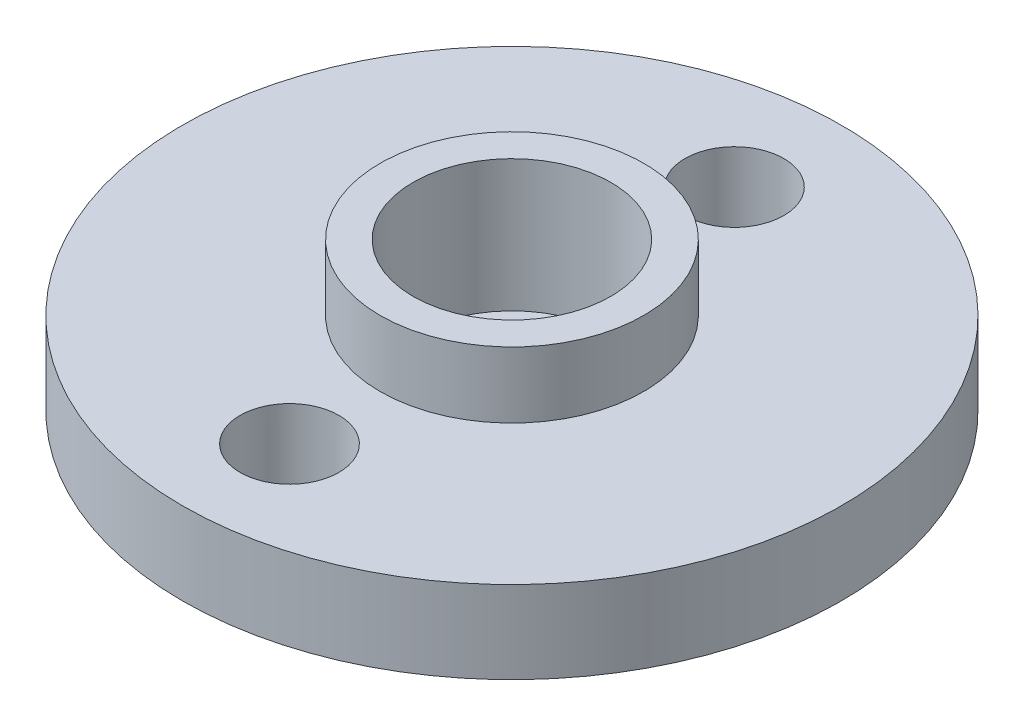
ISO-10303-21;
HEADER;
FILE_DESCRIPTION(('STEP AP214'),'2;1');
FILE_NAME('part.step','',(''),(''),'','','');
FILE_SCHEMA(('AUTOMOTIVE_DESIGN { 1 0 10303 214 1 1 1 1 }'));
ENDSEC;
DATA;
#1=APPLICATION_CONTEXT('core data for automotive mechanical design processes');
#2=APPLICATION_PROTOCOL_DEFINITION('international standard','automotive_design',2000,#1);
#3=PRODUCT_CONTEXT('',#1,'mechanical');
#4=PRODUCT('Part','Part','',(#3));
#5=PRODUCT_RELATED_PRODUCT_CATEGORY('part','',(#4));
#6=PRODUCT_DEFINITION_FORMATION('','',#4);
#7=PRODUCT_DEFINITION_CONTEXT('part definition',#1,'design');
#8=PRODUCT_DEFINITION('design','',#6,#7);
#9=PRODUCT_DEFINITION_SHAPE('','',#8);
#10=(LENGTH_UNIT() NAMED_UNIT(*) SI_UNIT(.MILLI.,.METRE.));
#11=(NAMED_UNIT(*) PLANE_ANGLE_UNIT() SI_UNIT($,.RADIAN.));
#12=(NAMED_UNIT(*) SI_UNIT($,.STERADIAN.) SOLID_ANGLE_UNIT());
#13=UNCERTAINTY_MEASURE_WITH_UNIT(LENGTH_MEASURE(1.E-05),#10,'distance_accuracy_value','');
#14=(GEOMETRIC_REPRESENTATION_CONTEXT(3) GLOBAL_UNCERTAINTY_ASSIGNED_CONTEXT((#13)) GLOBAL_UNIT_ASSIGNED_CONTEXT((#10,
#11,#12)) REPRESENTATION_CONTEXT('',''));
#15=CARTESIAN_POINT('',(0.,0.,0.));
#16=DIRECTION('',(0.,0.,1.));
#17=DIRECTION('',(1.,0.,0.));
#18=AXIS2_PLACEMENT_3D('',#15,#16,#17);
#19=CARTESIAN_POINT('',(0.,3.42447808333623,0.));
#20=DIRECTION('',(0.,1.,0.));
#21=DIRECTION('',(0.,0.,1.));
#22=AXIS2_PLACEMENT_3D('',#19,#20,#21);
#23=CYLINDRICAL_SURFACE('',#22,4.);
#24=CARTESIAN_POINT('',(0.,0.,0.));
#25=DIRECTION('',(0.,1.,0.));
#26=DIRECTION('',(0.,0.,1.));
#27=AXIS2_PLACEMENT_3D('',#24,#25,#26);
#28=CIRCLE('',#27,4.);
#29=CARTESIAN_POINT('',(0.,0.,4.));
#30=VERTEX_POINT('',#29);
#31=EDGE_CURVE('E10',#30,#30,#28,.T.);
#32=ORIENTED_EDGE('',*,*,#31,.F.);
#33=EDGE_LOOP('',(#32));
#34=FACE_BOUND('',#33,.T.);
#35=CARTESIAN_POINT('',(0.,-2.,0.));
#36=DIRECTION('',(0.,1.,0.));
#37=DIRECTION('',(0.,0.,1.));
#38=AXIS2_PLACEMENT_3D('',#35,#36,#37);
#39=CIRCLE('',#38,4.);
#40=CARTESIAN_POINT('',(0.,-2.,4.));
#41=VERTEX_POINT('',#40);
#42=EDGE_CURVE('E76',#41,#41,#39,.T.);
#43=ORIENTED_EDGE('',*,*,#42,.T.);
#44=EDGE_LOOP('',(#43));
#45=FACE_BOUND('',#44,.T.);
#46=ADVANCED_FACE('F41',(#34,#45),#23,.T.);
#47=CARTESIAN_POINT('',(3.,0.,0.));
#48=DIRECTION('',(0.,-1.,0.));
#49=DIRECTION('',(0.,0.,-1.));
#50=AXIS2_PLACEMENT_3D('',#47,#48,#49);
#51=PLANE('',#50);
#52=CARTESIAN_POINT('',(0.,0.,0.));
#53=DIRECTION('',(0.,1.,0.));
#54=DIRECTION('',(0.,0.,1.));
#55=AXIS2_PLACEMENT_3D('',#52,#53,#54);
#56=CIRCLE('',#55,3.);
#57=CARTESIAN_POINT('',(0.,0.,3.));
#58=VERTEX_POINT('',#57);
#59=EDGE_CURVE('E49',#58,#58,#56,.T.);
#60=ORIENTED_EDGE('',*,*,#59,.F.);
#61=EDGE_LOOP('',(#60));
#62=FACE_BOUND('',#61,.T.);
#63=ORIENTED_EDGE('',*,*,#31,.T.);
#64=EDGE_LOOP('',(#63));
#65=FACE_BOUND('',#64,.T.);
#66=ADVANCED_FACE('F111',(#62,#65),#51,.F.);
#67=CARTESIAN_POINT('',(0.,3.42447808333623,0.));
#68=DIRECTION('',(0.,1.,0.));
#69=DIRECTION('',(0.,0.,1.));
#70=AXIS2_PLACEMENT_3D('',#67,#68,#69);
#71=CYLINDRICAL_SURFACE('',#70,3.);
#72=CARTESIAN_POINT('',(0.,-4.,0.));
#73=DIRECTION('',(0.,1.,0.));
#74=DIRECTION('',(0.,0.,1.));
#75=AXIS2_PLACEMENT_3D('',#72,#73,#74);
#76=CIRCLE('',#75,3.);
#77=CARTESIAN_POINT('',(0.,-4.,3.));
#78=VERTEX_POINT('',#77);
#79=EDGE_CURVE('E54',#78,#78,#76,.T.);
#80=ORIENTED_EDGE('',*,*,#79,.F.);
#81=EDGE_LOOP('',(#80));
#82=FACE_BOUND('',#81,.T.);
#83=ORIENTED_EDGE('',*,*,#59,.T.);
#84=EDGE_LOOP('',(#83));
#85=FACE_BOUND('',#84,.T.);
#86=ADVANCED_FACE('F116',(#82,#85),#71,.F.);
#87=CARTESIAN_POINT('',(3.,-4.,0.));
#88=DIRECTION('',(0.,-1.,0.));
#89=DIRECTION('',(0.,0.,-1.));
#90=AXIS2_PLACEMENT_3D('',#87,#88,#89);
#91=PLANE('',#90);
#92=CARTESIAN_POINT('',(0.,-4.,0.));
#93=DIRECTION('',(0.,1.,0.));
#94=DIRECTION('',(0.,0.,1.));
#95=AXIS2_PLACEMENT_3D('',#92,#93,#94);
#96=CIRCLE('',#95,1.5);
#97=CARTESIAN_POINT('',(0.,-4.,1.5));
#98=VERTEX_POINT('',#97);
#99=EDGE_CURVE('E60',#98,#98,#96,.T.);
#100=ORIENTED_EDGE('',*,*,#99,.F.);
#101=EDGE_LOOP('',(#100));
#102=FACE_BOUND('',#101,.T.);
#103=ORIENTED_EDGE('',*,*,#79,.T.);
#104=EDGE_LOOP('',(#103));
#105=FACE_BOUND('',#104,.T.);
#106=ADVANCED_FACE('F141',(#102,#105),#91,.F.);
#107=CARTESIAN_POINT('',(0.,3.42447808333623,0.));
#108=DIRECTION('',(0.,1.,0.));
#109=DIRECTION('',(0.,0.,1.));
#110=AXIS2_PLACEMENT_3D('',#107,#108,#109);
#111=CYLINDRICAL_SURFACE('',#110,1.5);
#112=CARTESIAN_POINT('',(0.,-4.5,0.));
#113=DIRECTION('',(0.,1.,0.));
#114=DIRECTION('',(0.,0.,1.));
#115=AXIS2_PLACEMENT_3D('',#112,#113,#114);
#116=CIRCLE('',#115,1.5);
#117=CARTESIAN_POINT('',(0.,-4.5,1.5));
#118=VERTEX_POINT('',#117);
#119=EDGE_CURVE('E64',#118,#118,#116,.T.);
#120=ORIENTED_EDGE('',*,*,#119,.F.);
#121=EDGE_LOOP('',(#120));
#122=FACE_BOUND('',#121,.T.);
#123=ORIENTED_EDGE('',*,*,#99,.T.);
#124=EDGE_LOOP('',(#123));
#125=FACE_BOUND('',#124,.T.);
#126=ADVANCED_FACE('F135',(#122,#125),#111,.F.);
#127=CARTESIAN_POINT('',(10.,-4.5,0.));
#128=DIRECTION('',(0.,1.,0.));
#129=DIRECTION('',(0.,0.,1.));
#130=AXIS2_PLACEMENT_3D('',#127,#128,#129);
#131=PLANE('',#130);
#132=CARTESIAN_POINT('',(1.34211807239131E-13,-4.5,6.75));
#133=DIRECTION('',(0.,1.,0.));
#134=DIRECTION('',(0.,0.,1.));
#135=AXIS2_PLACEMENT_3D('',#132,#133,#134);
#136=CIRCLE('',#135,1.5);
#137=CARTESIAN_POINT('',(1.34211807239131E-13,-4.5,8.25));
#138=VERTEX_POINT('',#137);
#139=EDGE_CURVE('E85',#138,#138,#136,.T.);
#140=ORIENTED_EDGE('',*,*,#139,.T.);
#141=EDGE_LOOP('',(#140));
#142=FACE_BOUND('',#141,.T.);
#143=CARTESIAN_POINT('',(0.,-4.5,-6.75));
#144=DIRECTION('',(0.,1.,0.));
#145=DIRECTION('',(0.,0.,1.));
#146=AXIS2_PLACEMENT_3D('',#143,#144,#145);
#147=CIRCLE('',#146,1.5);
#148=CARTESIAN_POINT('',(0.,-4.5,-5.25));
#149=VERTEX_POINT('',#148);
#150=EDGE_CURVE('E80',#149,#149,#147,.T.);
#151=ORIENTED_EDGE('',*,*,#150,.T.);
#152=EDGE_LOOP('',(#151));
#153=FACE_BOUND('',#152,.T.);
#154=CARTESIAN_POINT('',(0.,-4.5,0.));
#155=DIRECTION('',(0.,1.,0.));
#156=DIRECTION('',(0.,0.,1.));
#157=AXIS2_PLACEMENT_3D('',#154,#155,#156);
#158=CIRCLE('',#157,10.);
#159=CARTESIAN_POINT('',(0.,-4.5,10.));
#160=VERTEX_POINT('',#159);
#161=EDGE_CURVE('E68',#160,#160,#158,.T.);
#162=ORIENTED_EDGE('',*,*,#161,.F.);
#163=EDGE_LOOP('',(#162));
#164=FACE_BOUND('',#163,.T.);
#165=ORIENTED_EDGE('',*,*,#119,.T.);
#166=EDGE_LOOP('',(#165));
#167=FACE_BOUND('',#166,.T.);
#168=ADVANCED_FACE('F129',(#142,#153,#164,#167),#131,.F.);
#169=CARTESIAN_POINT('',(0.,3.42447808333623,0.));
#170=DIRECTION('',(0.,1.,0.));
#171=DIRECTION('',(0.,0.,1.));
#172=AXIS2_PLACEMENT_3D('',#169,#170,#171);
#173=CYLINDRICAL_SURFACE('',#172,10.);
#174=CARTESIAN_POINT('',(0.,-2.,0.));
#175=DIRECTION('',(0.,1.,0.));
#176=DIRECTION('',(0.,0.,1.));
#177=AXIS2_PLACEMENT_3D('',#174,#175,#176);
#178=CIRCLE('',#177,10.);
#179=CARTESIAN_POINT('',(0.,-2.,10.));
#180=VERTEX_POINT('',#179);
#181=EDGE_CURVE('E72',#180,#180,#178,.T.);
#182=ORIENTED_EDGE('',*,*,#181,.F.);
#183=EDGE_LOOP('',(#182));
#184=FACE_BOUND('',#183,.T.);
#185=ORIENTED_EDGE('',*,*,#161,.T.);
#186=EDGE_LOOP('',(#185));
#187=FACE_BOUND('',#186,.T.);
#188=ADVANCED_FACE('F123',(#184,#187),#173,.T.);
#189=CARTESIAN_POINT('',(4.,-2.,0.));
#190=DIRECTION('',(0.,-1.,0.));
#191=DIRECTION('',(0.,0.,-1.));
#192=AXIS2_PLACEMENT_3D('',#189,#190,#191);
#193=PLANE('',#192);
#194=CARTESIAN_POINT('',(1.34211807239131E-13,-2.,6.75));
#195=DIRECTION('',(0.,-1.,0.));
#196=DIRECTION('',(0.,0.,-1.));
#197=AXIS2_PLACEMENT_3D('',#194,#195,#196);
#198=CIRCLE('',#197,1.5);
#199=CARTESIAN_POINT('',(1.34211807239131E-13,-2.,5.25));
#200=VERTEX_POINT('',#199);
#201=EDGE_CURVE('E44',#200,#200,#198,.T.);
#202=ORIENTED_EDGE('',*,*,#201,.T.);
#203=EDGE_LOOP('',(#202));
#204=FACE_BOUND('',#203,.T.);
#205=CARTESIAN_POINT('',(0.,-2.,-6.75));
#206=DIRECTION('',(0.,1.,0.));
#207=DIRECTION('',(0.,0.,1.));
#208=AXIS2_PLACEMENT_3D('',#205,#206,#207);
#209=CIRCLE('',#208,1.5);
#210=CARTESIAN_POINT('',(0.,-2.,-5.25));
#211=VERTEX_POINT('',#210);
#212=EDGE_CURVE('E81',#211,#211,#209,.T.);
#213=ORIENTED_EDGE('',*,*,#212,.F.);
#214=EDGE_LOOP('',(#213));
#215=FACE_BOUND('',#214,.T.);
#216=ORIENTED_EDGE('',*,*,#42,.F.);
#217=EDGE_LOOP('',(#216));
#218=FACE_BOUND('',#217,.T.);
#219=ORIENTED_EDGE('',*,*,#181,.T.);
#220=EDGE_LOOP('',(#219));
#221=FACE_BOUND('',#220,.T.);
#222=ADVANCED_FACE('F97',(#204,#215,#218,#221),#193,.F.);
#223=CARTESIAN_POINT('',(0.,-4.5,-6.75));
#224=DIRECTION('',(0.,1.,0.));
#225=DIRECTION('',(0.,0.,1.));
#226=AXIS2_PLACEMENT_3D('',#223,#224,#225);
#227=CYLINDRICAL_SURFACE('',#226,1.5);
#228=ORIENTED_EDGE('',*,*,#150,.F.);
#229=EDGE_LOOP('',(#228));
#230=FACE_BOUND('',#229,.T.);
#231=ORIENTED_EDGE('',*,*,#212,.T.);
#232=EDGE_LOOP('',(#231));
#233=FACE_BOUND('',#232,.T.);
#234=ADVANCED_FACE('F103',(#230,#233),#227,.F.);
#235=CARTESIAN_POINT('',(1.34211807239131E-13,0.,6.75));
#236=DIRECTION('',(0.,-1.,0.));
#237=DIRECTION('',(0.,0.,-1.));
#238=AXIS2_PLACEMENT_3D('',#235,#236,#237);
#239=CYLINDRICAL_SURFACE('',#238,1.5);
#240=ORIENTED_EDGE('',*,*,#201,.F.);
#241=EDGE_LOOP('',(#240));
#242=FACE_BOUND('',#241,.T.);
#243=ORIENTED_EDGE('',*,*,#139,.F.);
#244=EDGE_LOOP('',(#243));
#245=FACE_BOUND('',#244,.T.);
#246=ADVANCED_FACE('F100',(#242,#245),#239,.F.);
#247=CLOSED_SHELL('',(#46,#66,#86,#106,#126,#168,#188,#222,#234,#246));
#248=MANIFOLD_SOLID_BREP('B2',#247);
#249=ADVANCED_BREP_SHAPE_REPRESENTATION('',(#18,#248),#14);
#250=SHAPE_DEFINITION_REPRESENTATION(#9,#249);
ENDSEC;
END-ISO-10303-21;
